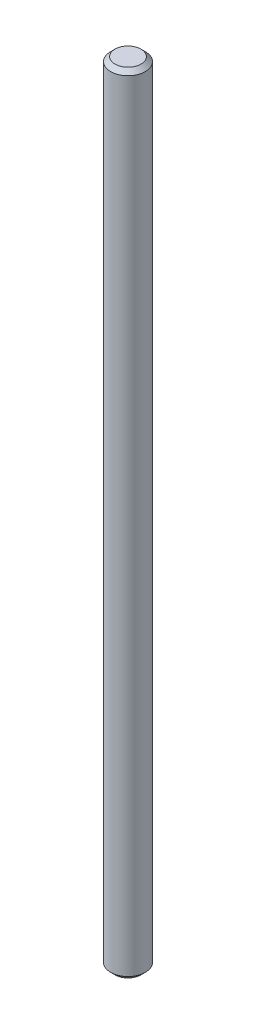
ISO-10303-21;
HEADER;
FILE_DESCRIPTION(('STEP AP214'),'2;1');
FILE_NAME('part.step','',(''),(''),'','','');
FILE_SCHEMA(('AUTOMOTIVE_DESIGN { 1 0 10303 214 1 1 1 1 }'));
ENDSEC;
DATA;
#1=APPLICATION_CONTEXT('core data for automotive mechanical design processes');
#2=APPLICATION_PROTOCOL_DEFINITION('international standard','automotive_design',2000,#1);
#3=PRODUCT_CONTEXT('',#1,'mechanical');
#4=PRODUCT('Part','Part','',(#3));
#5=PRODUCT_RELATED_PRODUCT_CATEGORY('part','',(#4));
#6=PRODUCT_DEFINITION_FORMATION('','',#4);
#7=PRODUCT_DEFINITION_CONTEXT('part definition',#1,'design');
#8=PRODUCT_DEFINITION('design','',#6,#7);
#9=PRODUCT_DEFINITION_SHAPE('','',#8);
#10=(LENGTH_UNIT() NAMED_UNIT(*) SI_UNIT(.MILLI.,.METRE.));
#11=(NAMED_UNIT(*) PLANE_ANGLE_UNIT() SI_UNIT($,.RADIAN.));
#12=(NAMED_UNIT(*) SI_UNIT($,.STERADIAN.) SOLID_ANGLE_UNIT());
#13=UNCERTAINTY_MEASURE_WITH_UNIT(LENGTH_MEASURE(1.E-05),#10,'distance_accuracy_value','');
#14=(GEOMETRIC_REPRESENTATION_CONTEXT(3) GLOBAL_UNCERTAINTY_ASSIGNED_CONTEXT((#13)) GLOBAL_UNIT_ASSIGNED_CONTEXT((#10,
#11,#12)) REPRESENTATION_CONTEXT('',''));
#15=CARTESIAN_POINT('',(0.,0.,0.));
#16=DIRECTION('',(0.,0.,1.));
#17=DIRECTION('',(1.,0.,0.));
#18=AXIS2_PLACEMENT_3D('',#15,#16,#17);
#19=CARTESIAN_POINT('',(0.,182.,0.));
#20=DIRECTION('',(0.,1.,0.));
#21=DIRECTION('',(1.,0.,0.));
#22=AXIS2_PLACEMENT_3D('',#19,#20,#21);
#23=PLANE('',#22);
#24=CARTESIAN_POINT('',(0.,182.,0.));
#25=DIRECTION('',(0.,-1.,0.));
#26=DIRECTION('',(1.,0.,0.));
#27=AXIS2_PLACEMENT_3D('',#24,#25,#26);
#28=CIRCLE('',#27,3.);
#29=CARTESIAN_POINT('',(-3.,182.,0.));
#30=VERTEX_POINT('',#29);
#31=EDGE_CURVE('E20',#30,#30,#28,.T.);
#32=ORIENTED_EDGE('',*,*,#31,.F.);
#33=EDGE_LOOP('',(#32));
#34=FACE_BOUND('',#33,.T.);
#35=ADVANCED_FACE('F17',(#34),#23,.T.);
#36=CARTESIAN_POINT('',(0.,181.5,0.));
#37=DIRECTION('',(0.,-1.,0.));
#38=DIRECTION('',(1.,0.,0.));
#39=AXIS2_PLACEMENT_3D('',#36,#37,#38);
#40=CONICAL_SURFACE('',#39,3.5,0.785398163397441);
#41=ORIENTED_EDGE('',*,*,#31,.T.);
#42=DIRECTION('',(-0.707106781186542,-0.707106781186553,0.));
#43=VECTOR('',#42,1.);
#44=CARTESIAN_POINT('',(-3.5,181.5,0.));
#45=LINE('',#44,#43);
#46=CARTESIAN_POINT('',(-4.,181.,0.));
#47=VERTEX_POINT('',#46);
#48=EDGE_CURVE('E11',#30,#47,#45,.T.);
#49=ORIENTED_EDGE('',*,*,#48,.T.);
#50=CARTESIAN_POINT('',(0.,181.,0.));
#51=DIRECTION('',(0.,1.,0.));
#52=DIRECTION('',(1.,0.,0.));
#53=AXIS2_PLACEMENT_3D('',#50,#51,#52);
#54=CIRCLE('',#53,4.);
#55=CARTESIAN_POINT('',(4.,181.,0.));
#56=VERTEX_POINT('',#55);
#57=EDGE_CURVE('E83',#47,#56,#54,.T.);
#58=ORIENTED_EDGE('',*,*,#57,.T.);
#59=CARTESIAN_POINT('',(0.,181.,0.));
#60=DIRECTION('',(0.,1.,0.));
#61=DIRECTION('',(1.,0.,0.));
#62=AXIS2_PLACEMENT_3D('',#59,#60,#61);
#63=CIRCLE('',#62,4.);
#64=EDGE_CURVE('E90',#56,#47,#63,.T.);
#65=ORIENTED_EDGE('',*,*,#64,.T.);
#66=ORIENTED_EDGE('',*,*,#48,.F.);
#67=EDGE_LOOP('',(#41,#49,#58,#65,#66));
#68=FACE_BOUND('',#67,.T.);
#69=ADVANCED_FACE('F98',(#68),#40,.T.);
#70=CARTESIAN_POINT('',(0.,0.,0.));
#71=DIRECTION('',(0.,1.,0.));
#72=DIRECTION('',(1.,0.,0.));
#73=AXIS2_PLACEMENT_3D('',#70,#71,#72);
#74=PLANE('',#73);
#75=CARTESIAN_POINT('',(0.,0.,0.));
#76=DIRECTION('',(0.,1.,0.));
#77=DIRECTION('',(1.,0.,0.));
#78=AXIS2_PLACEMENT_3D('',#75,#76,#77);
#79=CIRCLE('',#78,3.);
#80=CARTESIAN_POINT('',(-3.,0.,0.));
#81=VERTEX_POINT('',#80);
#82=EDGE_CURVE('E69',#81,#81,#79,.T.);
#83=ORIENTED_EDGE('',*,*,#82,.F.);
#84=EDGE_LOOP('',(#83));
#85=FACE_BOUND('',#84,.T.);
#86=ADVANCED_FACE('F104',(#85),#74,.F.);
#87=CARTESIAN_POINT('',(0.,0.,0.));
#88=DIRECTION('',(0.,1.,0.));
#89=DIRECTION('',(-1.,0.,0.));
#90=AXIS2_PLACEMENT_3D('',#87,#88,#89);
#91=CYLINDRICAL_SURFACE('',#90,4.);
#92=ORIENTED_EDGE('',*,*,#57,.F.);
#93=ORIENTED_EDGE('',*,*,#64,.F.);
#94=DIRECTION('',(0.,-1.,0.));
#95=VECTOR('',#94,1.);
#96=CARTESIAN_POINT('',(4.,0.,0.));
#97=LINE('',#96,#95);
#98=CARTESIAN_POINT('',(4.,1.,0.));
#99=VERTEX_POINT('',#98);
#100=EDGE_CURVE('E44',#56,#99,#97,.T.);
#101=ORIENTED_EDGE('',*,*,#100,.T.);
#102=CARTESIAN_POINT('',(0.,1.,0.));
#103=DIRECTION('',(0.,-1.,0.));
#104=DIRECTION('',(1.,0.,0.));
#105=AXIS2_PLACEMENT_3D('',#102,#103,#104);
#106=CIRCLE('',#105,4.);
#107=CARTESIAN_POINT('',(-4.,1.,0.));
#108=VERTEX_POINT('',#107);
#109=EDGE_CURVE('E68',#108,#99,#106,.T.);
#110=ORIENTED_EDGE('',*,*,#109,.F.);
#111=CARTESIAN_POINT('',(0.,1.,0.));
#112=DIRECTION('',(0.,-1.,0.));
#113=DIRECTION('',(1.,0.,0.));
#114=AXIS2_PLACEMENT_3D('',#111,#112,#113);
#115=CIRCLE('',#114,4.);
#116=EDGE_CURVE('E71',#99,#108,#115,.T.);
#117=ORIENTED_EDGE('',*,*,#116,.F.);
#118=ORIENTED_EDGE('',*,*,#100,.F.);
#119=EDGE_LOOP('',(#92,#93,#101,#110,#117,#118));
#120=FACE_BOUND('',#119,.T.);
#121=ADVANCED_FACE('F76',(#120),#91,.T.);
#122=CARTESIAN_POINT('',(0.,0.5,0.));
#123=DIRECTION('',(0.,1.,0.));
#124=DIRECTION('',(1.,0.,0.));
#125=AXIS2_PLACEMENT_3D('',#122,#123,#124);
#126=CONICAL_SURFACE('',#125,3.5,0.785398163397448);
#127=ORIENTED_EDGE('',*,*,#109,.T.);
#128=ORIENTED_EDGE('',*,*,#116,.T.);
#129=DIRECTION('',(0.707106781186547,-0.707106781186548,0.));
#130=VECTOR('',#129,1.);
#131=CARTESIAN_POINT('',(-3.5,0.5,0.));
#132=LINE('',#131,#130);
#133=EDGE_CURVE('E63',#108,#81,#132,.T.);
#134=ORIENTED_EDGE('',*,*,#133,.T.);
#135=ORIENTED_EDGE('',*,*,#82,.T.);
#136=ORIENTED_EDGE('',*,*,#133,.F.);
#137=EDGE_LOOP('',(#127,#128,#134,#135,#136));
#138=FACE_BOUND('',#137,.T.);
#139=ADVANCED_FACE('F66',(#138),#126,.T.);
#140=CLOSED_SHELL('',(#35,#69,#86,#121,#139));
#141=MANIFOLD_SOLID_BREP('B1',#140);
#142=ADVANCED_BREP_SHAPE_REPRESENTATION('',(#18,#141),#14);
#143=SHAPE_DEFINITION_REPRESENTATION(#9,#142);
ENDSEC;
END-ISO-10303-21;
